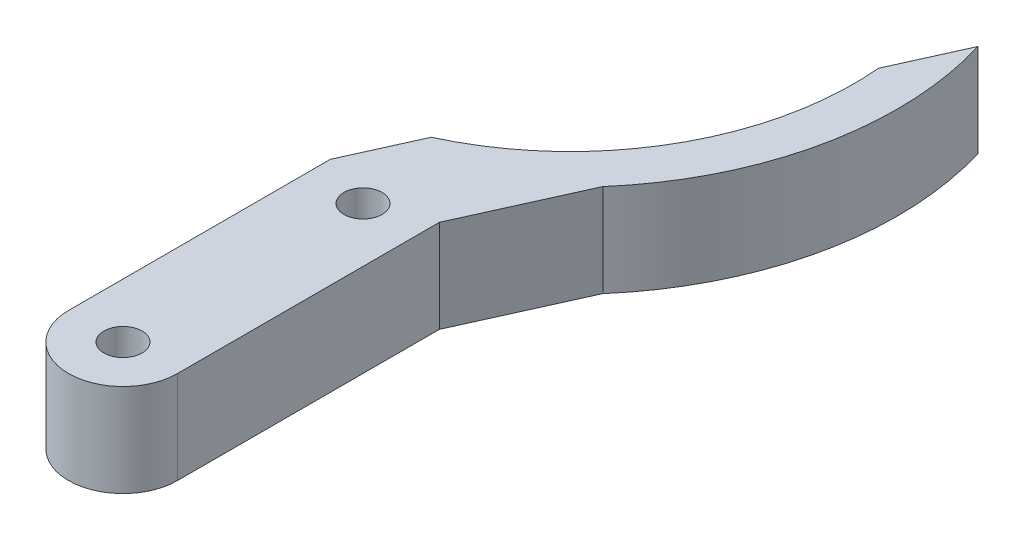
ISO-10303-21;
HEADER;
FILE_DESCRIPTION(('STEP AP214'),'2;1');
FILE_NAME('part.step','',(''),(''),'','','');
FILE_SCHEMA(('AUTOMOTIVE_DESIGN { 1 0 10303 214 1 1 1 1 }'));
ENDSEC;
DATA;
#1=APPLICATION_CONTEXT('core data for automotive mechanical design processes');
#2=APPLICATION_PROTOCOL_DEFINITION('international standard','automotive_design',2000,#1);
#3=PRODUCT_CONTEXT('',#1,'mechanical');
#4=PRODUCT('Part','Part','',(#3));
#5=PRODUCT_RELATED_PRODUCT_CATEGORY('part','',(#4));
#6=PRODUCT_DEFINITION_FORMATION('','',#4);
#7=PRODUCT_DEFINITION_CONTEXT('part definition',#1,'design');
#8=PRODUCT_DEFINITION('design','',#6,#7);
#9=PRODUCT_DEFINITION_SHAPE('','',#8);
#10=(LENGTH_UNIT() NAMED_UNIT(*) SI_UNIT(.MILLI.,.METRE.));
#11=(NAMED_UNIT(*) PLANE_ANGLE_UNIT() SI_UNIT($,.RADIAN.));
#12=(NAMED_UNIT(*) SI_UNIT($,.STERADIAN.) SOLID_ANGLE_UNIT());
#13=UNCERTAINTY_MEASURE_WITH_UNIT(LENGTH_MEASURE(1.E-05),#10,'distance_accuracy_value','');
#14=(GEOMETRIC_REPRESENTATION_CONTEXT(3) GLOBAL_UNCERTAINTY_ASSIGNED_CONTEXT((#13)) GLOBAL_UNIT_ASSIGNED_CONTEXT((#10,
#11,#12)) REPRESENTATION_CONTEXT('',''));
#15=CARTESIAN_POINT('',(0.,0.,0.));
#16=DIRECTION('',(0.,0.,1.));
#17=DIRECTION('',(1.,0.,0.));
#18=AXIS2_PLACEMENT_3D('',#15,#16,#17);
#19=CARTESIAN_POINT('',(0.,8.5,0.));
#20=DIRECTION('',(0.,-1.,0.));
#21=DIRECTION('',(0.,0.,-1.));
#22=AXIS2_PLACEMENT_3D('',#19,#20,#21);
#23=PLANE('',#22);
#24=CARTESIAN_POINT('',(0.,8.5,0.));
#25=DIRECTION('',(0.,1.,0.));
#26=DIRECTION('',(0.,0.,-1.));
#27=AXIS2_PLACEMENT_3D('',#24,#25,#26);
#28=CIRCLE('',#27,5.);
#29=CARTESIAN_POINT('',(-5.,8.5,0.));
#30=VERTEX_POINT('',#29);
#31=CARTESIAN_POINT('',(5.,8.5,0.));
#32=VERTEX_POINT('',#31);
#33=EDGE_CURVE('E146',#30,#32,#28,.T.);
#34=ORIENTED_EDGE('',*,*,#33,.T.);
#35=DIRECTION('',(0.,0.,-1.));
#36=VECTOR('',#35,1.);
#37=CARTESIAN_POINT('',(5.,8.5,0.));
#38=LINE('',#37,#36);
#39=CARTESIAN_POINT('',(5.,8.5,-24.));
#40=VERTEX_POINT('',#39);
#41=EDGE_CURVE('E94',#32,#40,#38,.T.);
#42=ORIENTED_EDGE('',*,*,#41,.T.);
#43=DIRECTION('',(0.410518105214538,0.,-0.911852447104829));
#44=VECTOR('',#43,1.);
#45=CARTESIAN_POINT('',(5.,8.5,-24.));
#46=LINE('',#45,#44);
#47=CARTESIAN_POINT('',(9.64959546109942,8.5,-34.3277905295683));
#48=VERTEX_POINT('',#47);
#49=EDGE_CURVE('E161',#40,#48,#46,.T.);
#50=ORIENTED_EDGE('',*,*,#49,.T.);
#51=CARTESIAN_POINT('',(-13.,8.5,-54.));
#52=DIRECTION('',(0.,1.,0.));
#53=DIRECTION('',(0.,0.,1.));
#54=AXIS2_PLACEMENT_3D('',#51,#52,#53);
#55=CIRCLE('',#54,30.);
#56=CARTESIAN_POINT('',(15.7269835510556,8.5,-62.6464105880638));
#57=VERTEX_POINT('',#56);
#58=EDGE_CURVE('E174',#48,#57,#55,.T.);
#59=ORIENTED_EDGE('',*,*,#58,.T.);
#60=DIRECTION('',(-0.41051810521454,0.,0.911852447104828));
#61=VECTOR('',#60,1.);
#62=CARTESIAN_POINT('',(12.8933695619152,8.5,-56.3523207115702));
#63=LINE('',#62,#61);
#64=CARTESIAN_POINT('',(12.8933695619152,8.5,-56.3523207115702));
#65=VERTEX_POINT('',#64);
#66=EDGE_CURVE('E113',#57,#65,#63,.T.);
#67=ORIENTED_EDGE('',*,*,#66,.T.);
#68=CARTESIAN_POINT('',(-13.,8.5,-54.));
#69=DIRECTION('',(0.,-1.,0.));
#70=DIRECTION('',(0.,0.,1.));
#71=AXIS2_PLACEMENT_3D('',#68,#69,#70);
#72=CIRCLE('',#71,26.);
#73=CARTESIAN_POINT('',(-2.12637326349823,8.5,-30.3829671297338));
#74=VERTEX_POINT('',#73);
#75=EDGE_CURVE('E107',#65,#74,#72,.T.);
#76=ORIENTED_EDGE('',*,*,#75,.T.);
#77=DIRECTION('',(-0.410518105214538,0.,0.911852447104829));
#78=VECTOR('',#77,1.);
#79=CARTESIAN_POINT('',(-5.,8.5,-24.));
#80=LINE('',#79,#78);
#81=CARTESIAN_POINT('',(-5.,8.5,-24.));
#82=VERTEX_POINT('',#81);
#83=EDGE_CURVE('E111',#74,#82,#80,.T.);
#84=ORIENTED_EDGE('',*,*,#83,.T.);
#85=DIRECTION('',(0.,0.,1.));
#86=VECTOR('',#85,1.);
#87=CARTESIAN_POINT('',(-5.,8.5,0.));
#88=LINE('',#87,#86);
#89=EDGE_CURVE('E51',#82,#30,#88,.T.);
#90=ORIENTED_EDGE('',*,*,#89,.T.);
#91=EDGE_LOOP('',(#34,#42,#50,#59,#67,#76,#84,#90));
#92=FACE_BOUND('',#91,.T.);
#93=CARTESIAN_POINT('',(0.,8.5,0.));
#94=DIRECTION('',(0.,1.,0.));
#95=DIRECTION('',(0.,0.,1.));
#96=AXIS2_PLACEMENT_3D('',#93,#94,#95);
#97=CIRCLE('',#96,1.75);
#98=CARTESIAN_POINT('',(0.,8.5,1.75));
#99=VERTEX_POINT('',#98);
#100=EDGE_CURVE('E135',#99,#99,#97,.T.);
#101=ORIENTED_EDGE('',*,*,#100,.F.);
#102=EDGE_LOOP('',(#101));
#103=FACE_BOUND('',#102,.T.);
#104=CARTESIAN_POINT('',(0.,8.5,-22.));
#105=DIRECTION('',(0.,1.,0.));
#106=DIRECTION('',(0.,0.,1.));
#107=AXIS2_PLACEMENT_3D('',#104,#105,#106);
#108=CIRCLE('',#107,1.75);
#109=CARTESIAN_POINT('',(0.,8.5,-20.25));
#110=VERTEX_POINT('',#109);
#111=EDGE_CURVE('E183',#110,#110,#108,.T.);
#112=ORIENTED_EDGE('',*,*,#111,.F.);
#113=EDGE_LOOP('',(#112));
#114=FACE_BOUND('',#113,.T.);
#115=ADVANCED_FACE('F34',(#92,#103,#114),#23,.F.);
#116=CARTESIAN_POINT('',(0.,0.,0.));
#117=DIRECTION('',(0.,-1.,0.));
#118=DIRECTION('',(0.,0.,-1.));
#119=AXIS2_PLACEMENT_3D('',#116,#117,#118);
#120=PLANE('',#119);
#121=CARTESIAN_POINT('',(0.,0.,0.));
#122=DIRECTION('',(0.,1.,0.));
#123=DIRECTION('',(0.,0.,1.));
#124=AXIS2_PLACEMENT_3D('',#121,#122,#123);
#125=CIRCLE('',#124,1.75);
#126=CARTESIAN_POINT('',(0.,0.,1.75));
#127=VERTEX_POINT('',#126);
#128=EDGE_CURVE('E180',#127,#127,#125,.T.);
#129=ORIENTED_EDGE('',*,*,#128,.T.);
#130=EDGE_LOOP('',(#129));
#131=FACE_BOUND('',#130,.T.);
#132=CARTESIAN_POINT('',(0.,0.,0.));
#133=DIRECTION('',(0.,1.,0.));
#134=DIRECTION('',(0.,0.,-1.));
#135=AXIS2_PLACEMENT_3D('',#132,#133,#134);
#136=CIRCLE('',#135,5.);
#137=CARTESIAN_POINT('',(-5.,0.,0.));
#138=VERTEX_POINT('',#137);
#139=CARTESIAN_POINT('',(5.,0.,0.));
#140=VERTEX_POINT('',#139);
#141=EDGE_CURVE('E131',#138,#140,#136,.T.);
#142=ORIENTED_EDGE('',*,*,#141,.F.);
#143=DIRECTION('',(0.,0.,1.));
#144=VECTOR('',#143,1.);
#145=CARTESIAN_POINT('',(-5.,0.,0.));
#146=LINE('',#145,#144);
#147=CARTESIAN_POINT('',(-5.,0.,-24.));
#148=VERTEX_POINT('',#147);
#149=EDGE_CURVE('E86',#148,#138,#146,.T.);
#150=ORIENTED_EDGE('',*,*,#149,.F.);
#151=DIRECTION('',(-0.410518105214538,0.,0.911852447104829));
#152=VECTOR('',#151,1.);
#153=CARTESIAN_POINT('',(-5.,0.,-24.));
#154=LINE('',#153,#152);
#155=CARTESIAN_POINT('',(-2.12637326349823,0.,-30.3829671297338));
#156=VERTEX_POINT('',#155);
#157=EDGE_CURVE('E80',#156,#148,#154,.T.);
#158=ORIENTED_EDGE('',*,*,#157,.F.);
#159=CARTESIAN_POINT('',(-13.,0.,-54.));
#160=DIRECTION('',(0.,-1.,0.));
#161=DIRECTION('',(0.,0.,1.));
#162=AXIS2_PLACEMENT_3D('',#159,#160,#161);
#163=CIRCLE('',#162,26.);
#164=CARTESIAN_POINT('',(12.8933695619152,0.,-56.3523207115702));
#165=VERTEX_POINT('',#164);
#166=EDGE_CURVE('E121',#165,#156,#163,.T.);
#167=ORIENTED_EDGE('',*,*,#166,.F.);
#168=DIRECTION('',(-0.41051810521454,0.,0.911852447104828));
#169=VECTOR('',#168,1.);
#170=CARTESIAN_POINT('',(12.8933695619152,0.,-56.3523207115702));
#171=LINE('',#170,#169);
#172=CARTESIAN_POINT('',(15.7269835510556,0.,-62.6464105880638));
#173=VERTEX_POINT('',#172);
#174=EDGE_CURVE('E141',#173,#165,#171,.T.);
#175=ORIENTED_EDGE('',*,*,#174,.F.);
#176=CARTESIAN_POINT('',(-13.,0.,-54.));
#177=DIRECTION('',(0.,1.,0.));
#178=DIRECTION('',(0.,0.,1.));
#179=AXIS2_PLACEMENT_3D('',#176,#177,#178);
#180=CIRCLE('',#179,30.);
#181=CARTESIAN_POINT('',(9.64959546109942,0.,-34.3277905295683));
#182=VERTEX_POINT('',#181);
#183=EDGE_CURVE('E139',#182,#173,#180,.T.);
#184=ORIENTED_EDGE('',*,*,#183,.F.);
#185=DIRECTION('',(0.410518105214538,0.,-0.911852447104829));
#186=VECTOR('',#185,1.);
#187=CARTESIAN_POINT('',(5.,0.,-24.));
#188=LINE('',#187,#186);
#189=CARTESIAN_POINT('',(5.,0.,-24.));
#190=VERTEX_POINT('',#189);
#191=EDGE_CURVE('E137',#190,#182,#188,.T.);
#192=ORIENTED_EDGE('',*,*,#191,.F.);
#193=DIRECTION('',(0.,0.,-1.));
#194=VECTOR('',#193,1.);
#195=CARTESIAN_POINT('',(5.,0.,0.));
#196=LINE('',#195,#194);
#197=EDGE_CURVE('E134',#140,#190,#196,.T.);
#198=ORIENTED_EDGE('',*,*,#197,.F.);
#199=EDGE_LOOP('',(#142,#150,#158,#167,#175,#184,#192,#198));
#200=FACE_BOUND('',#199,.T.);
#201=CARTESIAN_POINT('',(0.,0.,-22.));
#202=DIRECTION('',(0.,1.,0.));
#203=DIRECTION('',(0.,0.,1.));
#204=AXIS2_PLACEMENT_3D('',#201,#202,#203);
#205=CIRCLE('',#204,1.75);
#206=CARTESIAN_POINT('',(0.,0.,-20.25));
#207=VERTEX_POINT('',#206);
#208=EDGE_CURVE('E186',#207,#207,#205,.T.);
#209=ORIENTED_EDGE('',*,*,#208,.T.);
#210=EDGE_LOOP('',(#209));
#211=FACE_BOUND('',#210,.T.);
#212=ADVANCED_FACE('F165',(#131,#200,#211),#120,.T.);
#213=CARTESIAN_POINT('',(0.,8.5,0.));
#214=DIRECTION('',(0.,-1.,0.));
#215=DIRECTION('',(0.,0.,-1.));
#216=AXIS2_PLACEMENT_3D('',#213,#214,#215);
#217=CYLINDRICAL_SURFACE('',#216,5.);
#218=ORIENTED_EDGE('',*,*,#141,.T.);
#219=DIRECTION('',(0.,-1.,0.));
#220=VECTOR('',#219,1.);
#221=CARTESIAN_POINT('',(5.,8.5,0.));
#222=LINE('',#221,#220);
#223=EDGE_CURVE('E11',#32,#140,#222,.T.);
#224=ORIENTED_EDGE('',*,*,#223,.F.);
#225=ORIENTED_EDGE('',*,*,#33,.F.);
#226=DIRECTION('',(0.,-1.,0.));
#227=VECTOR('',#226,1.);
#228=CARTESIAN_POINT('',(-5.,8.5,0.));
#229=LINE('',#228,#227);
#230=EDGE_CURVE('E127',#30,#138,#229,.T.);
#231=ORIENTED_EDGE('',*,*,#230,.T.);
#232=EDGE_LOOP('',(#218,#224,#225,#231));
#233=FACE_BOUND('',#232,.T.);
#234=ADVANCED_FACE('F36',(#233),#217,.T.);
#235=CARTESIAN_POINT('',(5.,8.5,0.));
#236=DIRECTION('',(-1.,0.,0.));
#237=DIRECTION('',(0.,0.,1.));
#238=AXIS2_PLACEMENT_3D('',#235,#236,#237);
#239=PLANE('',#238);
#240=ORIENTED_EDGE('',*,*,#197,.T.);
#241=DIRECTION('',(0.,-1.,0.));
#242=VECTOR('',#241,1.);
#243=CARTESIAN_POINT('',(5.,8.5,-24.));
#244=LINE('',#243,#242);
#245=EDGE_CURVE('E43',#40,#190,#244,.T.);
#246=ORIENTED_EDGE('',*,*,#245,.F.);
#247=ORIENTED_EDGE('',*,*,#41,.F.);
#248=ORIENTED_EDGE('',*,*,#223,.T.);
#249=EDGE_LOOP('',(#240,#246,#247,#248));
#250=FACE_BOUND('',#249,.T.);
#251=ADVANCED_FACE('F218',(#250),#239,.F.);
#252=CARTESIAN_POINT('',(5.,8.5,-24.));
#253=DIRECTION('',(-0.911852447104829,0.,-0.410518105214538));
#254=DIRECTION('',(-0.410518105214538,0.,0.911852447104829));
#255=AXIS2_PLACEMENT_3D('',#252,#253,#254);
#256=PLANE('',#255);
#257=ORIENTED_EDGE('',*,*,#191,.T.);
#258=DIRECTION('',(0.,-1.,0.));
#259=VECTOR('',#258,1.);
#260=CARTESIAN_POINT('',(9.64959546109942,8.5,-34.3277905295683));
#261=LINE('',#260,#259);
#262=EDGE_CURVE('E153',#48,#182,#261,.T.);
#263=ORIENTED_EDGE('',*,*,#262,.F.);
#264=ORIENTED_EDGE('',*,*,#49,.F.);
#265=ORIENTED_EDGE('',*,*,#245,.T.);
#266=EDGE_LOOP('',(#257,#263,#264,#265));
#267=FACE_BOUND('',#266,.T.);
#268=ADVANCED_FACE('F159',(#267),#256,.F.);
#269=CARTESIAN_POINT('',(-13.,8.5,-54.));
#270=DIRECTION('',(0.,-1.,0.));
#271=DIRECTION('',(0.,0.,-1.));
#272=AXIS2_PLACEMENT_3D('',#269,#270,#271);
#273=CYLINDRICAL_SURFACE('',#272,30.);
#274=ORIENTED_EDGE('',*,*,#183,.T.);
#275=DIRECTION('',(0.,-1.,0.));
#276=VECTOR('',#275,1.);
#277=CARTESIAN_POINT('',(15.7269835510556,8.5,-62.6464105880638));
#278=LINE('',#277,#276);
#279=EDGE_CURVE('E150',#57,#173,#278,.T.);
#280=ORIENTED_EDGE('',*,*,#279,.F.);
#281=ORIENTED_EDGE('',*,*,#58,.F.);
#282=ORIENTED_EDGE('',*,*,#262,.T.);
#283=EDGE_LOOP('',(#274,#280,#281,#282));
#284=FACE_BOUND('',#283,.T.);
#285=ADVANCED_FACE('F170',(#284),#273,.T.);
#286=CARTESIAN_POINT('',(12.8933695619152,8.5,-56.3523207115702));
#287=DIRECTION('',(0.911852447104828,0.,0.41051810521454));
#288=DIRECTION('',(0.41051810521454,0.,-0.911852447104828));
#289=AXIS2_PLACEMENT_3D('',#286,#287,#288);
#290=PLANE('',#289);
#291=ORIENTED_EDGE('',*,*,#174,.T.);
#292=DIRECTION('',(0.,-1.,0.));
#293=VECTOR('',#292,1.);
#294=CARTESIAN_POINT('',(12.8933695619152,8.5,-56.3523207115702));
#295=LINE('',#294,#293);
#296=EDGE_CURVE('E122',#65,#165,#295,.T.);
#297=ORIENTED_EDGE('',*,*,#296,.F.);
#298=ORIENTED_EDGE('',*,*,#66,.F.);
#299=ORIENTED_EDGE('',*,*,#279,.T.);
#300=EDGE_LOOP('',(#291,#297,#298,#299));
#301=FACE_BOUND('',#300,.T.);
#302=ADVANCED_FACE('F173',(#301),#290,.F.);
#303=CARTESIAN_POINT('',(-13.,8.5,-54.));
#304=DIRECTION('',(0.,-1.,0.));
#305=DIRECTION('',(0.,0.,-1.));
#306=AXIS2_PLACEMENT_3D('',#303,#304,#305);
#307=CYLINDRICAL_SURFACE('',#306,26.);
#308=ORIENTED_EDGE('',*,*,#166,.T.);
#309=DIRECTION('',(0.,-1.,0.));
#310=VECTOR('',#309,1.);
#311=CARTESIAN_POINT('',(-2.12637326349823,8.5,-30.3829671297338));
#312=LINE('',#311,#310);
#313=EDGE_CURVE('E118',#74,#156,#312,.T.);
#314=ORIENTED_EDGE('',*,*,#313,.F.);
#315=ORIENTED_EDGE('',*,*,#75,.F.);
#316=ORIENTED_EDGE('',*,*,#296,.T.);
#317=EDGE_LOOP('',(#308,#314,#315,#316));
#318=FACE_BOUND('',#317,.T.);
#319=ADVANCED_FACE('F119',(#318),#307,.F.);
#320=CARTESIAN_POINT('',(-5.,8.5,-24.));
#321=DIRECTION('',(0.911852447104829,0.,0.410518105214538));
#322=DIRECTION('',(0.410518105214538,0.,-0.911852447104829));
#323=AXIS2_PLACEMENT_3D('',#320,#321,#322);
#324=PLANE('',#323);
#325=ORIENTED_EDGE('',*,*,#157,.T.);
#326=DIRECTION('',(0.,-1.,0.));
#327=VECTOR('',#326,1.);
#328=CARTESIAN_POINT('',(-5.,8.5,-24.));
#329=LINE('',#328,#327);
#330=EDGE_CURVE('E123',#82,#148,#329,.T.);
#331=ORIENTED_EDGE('',*,*,#330,.F.);
#332=ORIENTED_EDGE('',*,*,#83,.F.);
#333=ORIENTED_EDGE('',*,*,#313,.T.);
#334=EDGE_LOOP('',(#325,#331,#332,#333));
#335=FACE_BOUND('',#334,.T.);
#336=ADVANCED_FACE('F125',(#335),#324,.F.);
#337=CARTESIAN_POINT('',(-5.,8.5,0.));
#338=DIRECTION('',(1.,0.,0.));
#339=DIRECTION('',(0.,0.,-1.));
#340=AXIS2_PLACEMENT_3D('',#337,#338,#339);
#341=PLANE('',#340);
#342=ORIENTED_EDGE('',*,*,#149,.T.);
#343=ORIENTED_EDGE('',*,*,#230,.F.);
#344=ORIENTED_EDGE('',*,*,#89,.F.);
#345=ORIENTED_EDGE('',*,*,#330,.T.);
#346=EDGE_LOOP('',(#342,#343,#344,#345));
#347=FACE_BOUND('',#346,.T.);
#348=ADVANCED_FACE('F206',(#347),#341,.F.);
#349=CARTESIAN_POINT('',(0.,8.5,0.));
#350=DIRECTION('',(0.,-1.,0.));
#351=DIRECTION('',(0.,0.,-1.));
#352=AXIS2_PLACEMENT_3D('',#349,#350,#351);
#353=CYLINDRICAL_SURFACE('',#352,1.75);
#354=ORIENTED_EDGE('',*,*,#100,.T.);
#355=EDGE_LOOP('',(#354));
#356=FACE_BOUND('',#355,.T.);
#357=ORIENTED_EDGE('',*,*,#128,.F.);
#358=EDGE_LOOP('',(#357));
#359=FACE_BOUND('',#358,.T.);
#360=ADVANCED_FACE('F203',(#356,#359),#353,.F.);
#361=CARTESIAN_POINT('',(0.,8.5,-22.));
#362=DIRECTION('',(0.,-1.,0.));
#363=DIRECTION('',(0.,0.,-1.));
#364=AXIS2_PLACEMENT_3D('',#361,#362,#363);
#365=CYLINDRICAL_SURFACE('',#364,1.75);
#366=ORIENTED_EDGE('',*,*,#111,.T.);
#367=EDGE_LOOP('',(#366));
#368=FACE_BOUND('',#367,.T.);
#369=ORIENTED_EDGE('',*,*,#208,.F.);
#370=EDGE_LOOP('',(#369));
#371=FACE_BOUND('',#370,.T.);
#372=ADVANCED_FACE('F192',(#368,#371),#365,.F.);
#373=CLOSED_SHELL('',(#115,#212,#234,#251,#268,#285,#302,#319,#336,#348,#360,#372));
#374=MANIFOLD_SOLID_BREP('B2',#373);
#375=ADVANCED_BREP_SHAPE_REPRESENTATION('',(#18,#374),#14);
#376=SHAPE_DEFINITION_REPRESENTATION(#9,#375);
ENDSEC;
END-ISO-10303-21;
